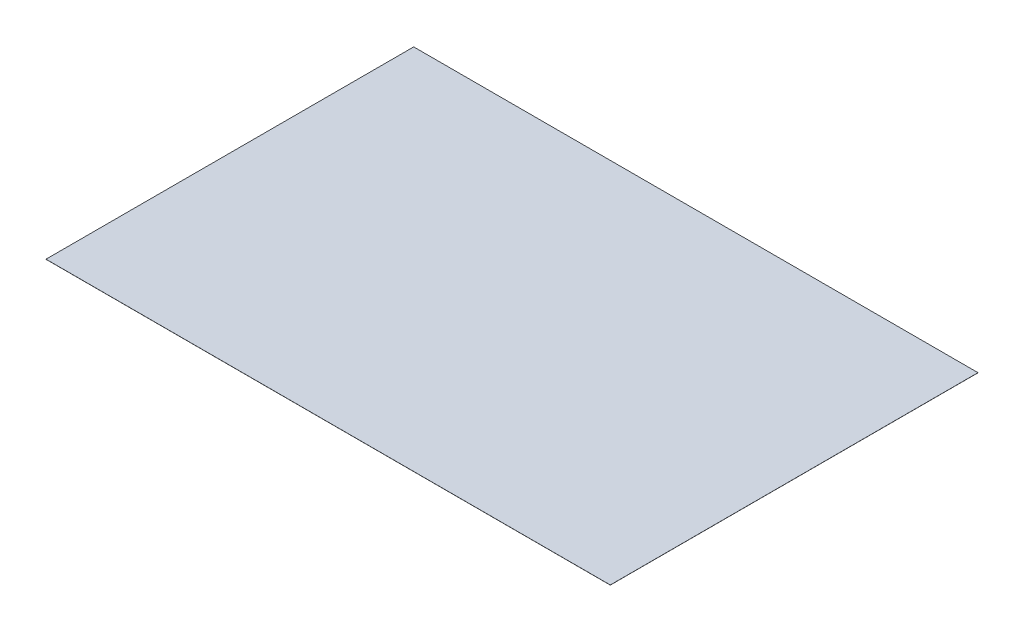
ISO-10303-21;
HEADER;
FILE_DESCRIPTION(('STEP AP214'),'2;1');
FILE_NAME('part.step','',(''),(''),'','','');
FILE_SCHEMA(('AUTOMOTIVE_DESIGN { 1 0 10303 214 1 1 1 1 }'));
ENDSEC;
DATA;
#1=APPLICATION_CONTEXT('core data for automotive mechanical design processes');
#2=APPLICATION_PROTOCOL_DEFINITION('international standard','automotive_design',2000,#1);
#3=PRODUCT_CONTEXT('',#1,'mechanical');
#4=PRODUCT('Part','Part','',(#3));
#5=PRODUCT_RELATED_PRODUCT_CATEGORY('part','',(#4));
#6=PRODUCT_DEFINITION_FORMATION('','',#4);
#7=PRODUCT_DEFINITION_CONTEXT('part definition',#1,'design');
#8=PRODUCT_DEFINITION('design','',#6,#7);
#9=PRODUCT_DEFINITION_SHAPE('','',#8);
#10=(LENGTH_UNIT() NAMED_UNIT(*) SI_UNIT(.MILLI.,.METRE.));
#11=(NAMED_UNIT(*) PLANE_ANGLE_UNIT() SI_UNIT($,.RADIAN.));
#12=(NAMED_UNIT(*) SI_UNIT($,.STERADIAN.) SOLID_ANGLE_UNIT());
#13=UNCERTAINTY_MEASURE_WITH_UNIT(LENGTH_MEASURE(1.E-05),#10,'distance_accuracy_value','');
#14=(GEOMETRIC_REPRESENTATION_CONTEXT(3) GLOBAL_UNCERTAINTY_ASSIGNED_CONTEXT((#13)) GLOBAL_UNIT_ASSIGNED_CONTEXT((#10,
#11,#12)) REPRESENTATION_CONTEXT('',''));
#15=CARTESIAN_POINT('',(0.,0.,0.));
#16=DIRECTION('',(0.,0.,1.));
#17=DIRECTION('',(1.,0.,0.));
#18=AXIS2_PLACEMENT_3D('',#15,#16,#17);
#19=CARTESIAN_POINT('',(0.,0.05,0.));
#20=DIRECTION('',(1.,0.,0.));
#21=DIRECTION('',(0.,0.,-1.));
#22=AXIS2_PLACEMENT_3D('',#19,#20,#21);
#23=PLANE('',#22);
#24=DIRECTION('',(0.,0.,1.));
#25=VECTOR('',#24,1.);
#26=CARTESIAN_POINT('',(0.,0.,0.));
#27=LINE('',#26,#25);
#28=CARTESIAN_POINT('',(0.,0.,-148.48));
#29=VERTEX_POINT('',#28);
#30=CARTESIAN_POINT('',(0.,0.,0.));
#31=VERTEX_POINT('',#30);
#32=EDGE_CURVE('E96',#29,#31,#27,.T.);
#33=ORIENTED_EDGE('',*,*,#32,.T.);
#34=DIRECTION('',(0.,-1.,0.));
#35=VECTOR('',#34,1.);
#36=CARTESIAN_POINT('',(0.,0.05,0.));
#37=LINE('',#36,#35);
#38=CARTESIAN_POINT('',(0.,0.05,0.));
#39=VERTEX_POINT('',#38);
#40=EDGE_CURVE('E11',#39,#31,#37,.T.);
#41=ORIENTED_EDGE('',*,*,#40,.F.);
#42=DIRECTION('',(0.,0.,1.));
#43=VECTOR('',#42,1.);
#44=CARTESIAN_POINT('',(0.,0.05,0.));
#45=LINE('',#44,#43);
#46=CARTESIAN_POINT('',(0.,0.05,-148.48));
#47=VERTEX_POINT('',#46);
#48=EDGE_CURVE('E84',#47,#39,#45,.T.);
#49=ORIENTED_EDGE('',*,*,#48,.F.);
#50=DIRECTION('',(0.,-1.,0.));
#51=VECTOR('',#50,1.);
#52=CARTESIAN_POINT('',(0.,0.05,-148.48));
#53=LINE('',#52,#51);
#54=EDGE_CURVE('E92',#47,#29,#53,.T.);
#55=ORIENTED_EDGE('',*,*,#54,.T.);
#56=EDGE_LOOP('',(#33,#41,#49,#55));
#57=FACE_BOUND('',#56,.T.);
#58=ADVANCED_FACE('F33',(#57),#23,.F.);
#59=CARTESIAN_POINT('',(0.,0.05,0.));
#60=DIRECTION('',(0.,0.,-1.));
#61=DIRECTION('',(-1.,0.,0.));
#62=AXIS2_PLACEMENT_3D('',#59,#60,#61);
#63=PLANE('',#62);
#64=DIRECTION('',(1.,0.,0.));
#65=VECTOR('',#64,1.);
#66=CARTESIAN_POINT('',(0.,0.,0.));
#67=LINE('',#66,#65);
#68=CARTESIAN_POINT('',(227.86,0.,0.));
#69=VERTEX_POINT('',#68);
#70=EDGE_CURVE('E88',#31,#69,#67,.T.);
#71=ORIENTED_EDGE('',*,*,#70,.T.);
#72=DIRECTION('',(0.,-1.,0.));
#73=VECTOR('',#72,1.);
#74=CARTESIAN_POINT('',(227.86,0.05,0.));
#75=LINE('',#74,#73);
#76=CARTESIAN_POINT('',(227.86,0.05,0.));
#77=VERTEX_POINT('',#76);
#78=EDGE_CURVE('E41',#77,#69,#75,.T.);
#79=ORIENTED_EDGE('',*,*,#78,.F.);
#80=DIRECTION('',(1.,0.,0.));
#81=VECTOR('',#80,1.);
#82=CARTESIAN_POINT('',(0.,0.05,0.));
#83=LINE('',#82,#81);
#84=EDGE_CURVE('E79',#39,#77,#83,.T.);
#85=ORIENTED_EDGE('',*,*,#84,.F.);
#86=ORIENTED_EDGE('',*,*,#40,.T.);
#87=EDGE_LOOP('',(#71,#79,#85,#86));
#88=FACE_BOUND('',#87,.T.);
#89=ADVANCED_FACE('F87',(#88),#63,.F.);
#90=CARTESIAN_POINT('',(227.86,0.05,0.));
#91=DIRECTION('',(-1.,0.,0.));
#92=DIRECTION('',(0.,0.,1.));
#93=AXIS2_PLACEMENT_3D('',#90,#91,#92);
#94=PLANE('',#93);
#95=DIRECTION('',(0.,0.,-1.));
#96=VECTOR('',#95,1.);
#97=CARTESIAN_POINT('',(227.86,0.,0.));
#98=LINE('',#97,#96);
#99=CARTESIAN_POINT('',(227.86,0.,-148.48));
#100=VERTEX_POINT('',#99);
#101=EDGE_CURVE('E66',#69,#100,#98,.T.);
#102=ORIENTED_EDGE('',*,*,#101,.T.);
#103=DIRECTION('',(0.,-1.,0.));
#104=VECTOR('',#103,1.);
#105=CARTESIAN_POINT('',(227.86,0.05,-148.48));
#106=LINE('',#105,#104);
#107=CARTESIAN_POINT('',(227.86,0.05,-148.48));
#108=VERTEX_POINT('',#107);
#109=EDGE_CURVE('E89',#108,#100,#106,.T.);
#110=ORIENTED_EDGE('',*,*,#109,.F.);
#111=DIRECTION('',(0.,0.,-1.));
#112=VECTOR('',#111,1.);
#113=CARTESIAN_POINT('',(227.86,0.05,0.));
#114=LINE('',#113,#112);
#115=EDGE_CURVE('E82',#77,#108,#114,.T.);
#116=ORIENTED_EDGE('',*,*,#115,.F.);
#117=ORIENTED_EDGE('',*,*,#78,.T.);
#118=EDGE_LOOP('',(#102,#110,#116,#117));
#119=FACE_BOUND('',#118,.T.);
#120=ADVANCED_FACE('F90',(#119),#94,.F.);
#121=CARTESIAN_POINT('',(0.,0.05,-148.48));
#122=DIRECTION('',(0.,0.,1.));
#123=DIRECTION('',(1.,0.,0.));
#124=AXIS2_PLACEMENT_3D('',#121,#122,#123);
#125=PLANE('',#124);
#126=DIRECTION('',(-1.,0.,0.));
#127=VECTOR('',#126,1.);
#128=CARTESIAN_POINT('',(0.,0.,-148.48));
#129=LINE('',#128,#127);
#130=EDGE_CURVE('E72',#100,#29,#129,.T.);
#131=ORIENTED_EDGE('',*,*,#130,.T.);
#132=ORIENTED_EDGE('',*,*,#54,.F.);
#133=DIRECTION('',(-1.,0.,0.));
#134=VECTOR('',#133,1.);
#135=CARTESIAN_POINT('',(0.,0.05,-148.48));
#136=LINE('',#135,#134);
#137=EDGE_CURVE('E49',#108,#47,#136,.T.);
#138=ORIENTED_EDGE('',*,*,#137,.F.);
#139=ORIENTED_EDGE('',*,*,#109,.T.);
#140=EDGE_LOOP('',(#131,#132,#138,#139));
#141=FACE_BOUND('',#140,.T.);
#142=ADVANCED_FACE('F103',(#141),#125,.F.);
#143=CARTESIAN_POINT('',(0.,0.05,-148.48));
#144=DIRECTION('',(0.,-1.,0.));
#145=DIRECTION('',(0.,0.,-1.));
#146=AXIS2_PLACEMENT_3D('',#143,#144,#145);
#147=PLANE('',#146);
#148=ORIENTED_EDGE('',*,*,#48,.T.);
#149=ORIENTED_EDGE('',*,*,#84,.T.);
#150=ORIENTED_EDGE('',*,*,#115,.T.);
#151=ORIENTED_EDGE('',*,*,#137,.T.);
#152=EDGE_LOOP('',(#148,#149,#150,#151));
#153=FACE_BOUND('',#152,.T.);
#154=ADVANCED_FACE('F80',(#153),#147,.F.);
#155=CARTESIAN_POINT('',(0.,0.,-148.48));
#156=DIRECTION('',(0.,-1.,0.));
#157=DIRECTION('',(0.,0.,-1.));
#158=AXIS2_PLACEMENT_3D('',#155,#156,#157);
#159=PLANE('',#158);
#160=ORIENTED_EDGE('',*,*,#32,.F.);
#161=ORIENTED_EDGE('',*,*,#130,.F.);
#162=ORIENTED_EDGE('',*,*,#101,.F.);
#163=ORIENTED_EDGE('',*,*,#70,.F.);
#164=EDGE_LOOP('',(#160,#161,#162,#163));
#165=FACE_BOUND('',#164,.T.);
#166=ADVANCED_FACE('F106',(#165),#159,.T.);
#167=CLOSED_SHELL('',(#58,#89,#120,#142,#154,#166));
#168=MANIFOLD_SOLID_BREP('B2',#167);
#169=ADVANCED_BREP_SHAPE_REPRESENTATION('',(#18,#168),#14);
#170=SHAPE_DEFINITION_REPRESENTATION(#9,#169);
ENDSEC;
END-ISO-10303-21;
